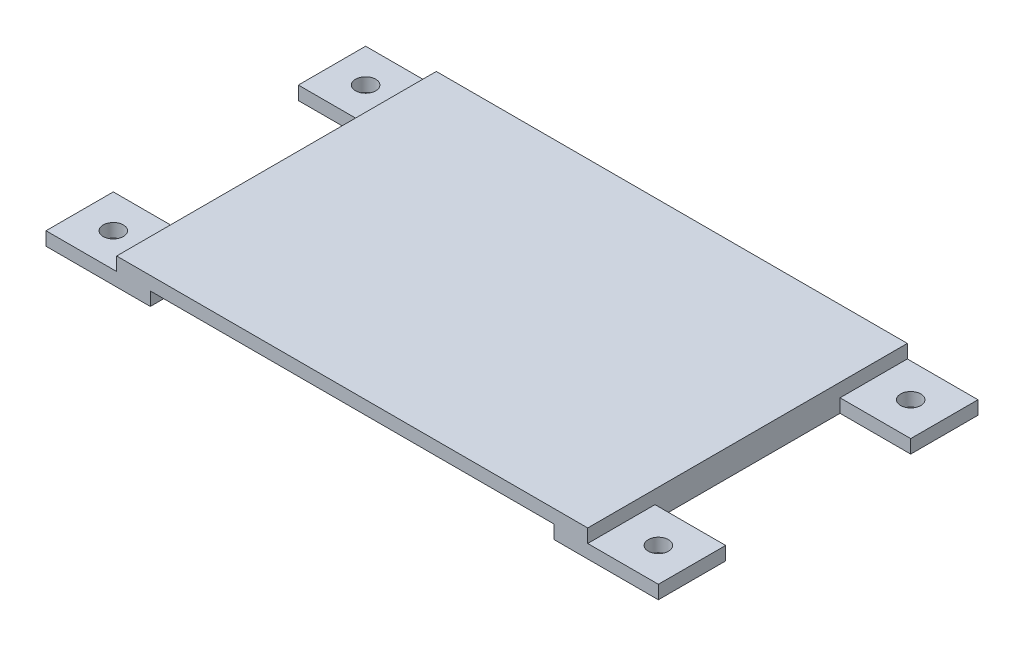
ISO-10303-21;
HEADER;
FILE_DESCRIPTION(('STEP AP214'),'2;1');
FILE_NAME('part.step','',(''),(''),'','','');
FILE_SCHEMA(('AUTOMOTIVE_DESIGN { 1 0 10303 214 1 1 1 1 }'));
ENDSEC;
DATA;
#1=APPLICATION_CONTEXT('core data for automotive mechanical design processes');
#2=APPLICATION_PROTOCOL_DEFINITION('international standard','automotive_design',2000,#1);
#3=PRODUCT_CONTEXT('',#1,'mechanical');
#4=PRODUCT('Part','Part','',(#3));
#5=PRODUCT_RELATED_PRODUCT_CATEGORY('part','',(#4));
#6=PRODUCT_DEFINITION_FORMATION('','',#4);
#7=PRODUCT_DEFINITION_CONTEXT('part definition',#1,'design');
#8=PRODUCT_DEFINITION('design','',#6,#7);
#9=PRODUCT_DEFINITION_SHAPE('','',#8);
#10=(LENGTH_UNIT() NAMED_UNIT(*) SI_UNIT(.MILLI.,.METRE.));
#11=(NAMED_UNIT(*) PLANE_ANGLE_UNIT() SI_UNIT($,.RADIAN.));
#12=(NAMED_UNIT(*) SI_UNIT($,.STERADIAN.) SOLID_ANGLE_UNIT());
#13=UNCERTAINTY_MEASURE_WITH_UNIT(LENGTH_MEASURE(1.E-05),#10,'distance_accuracy_value','');
#14=(GEOMETRIC_REPRESENTATION_CONTEXT(3) GLOBAL_UNCERTAINTY_ASSIGNED_CONTEXT((#13)) GLOBAL_UNIT_ASSIGNED_CONTEXT((#10,
#11,#12)) REPRESENTATION_CONTEXT('',''));
#15=CARTESIAN_POINT('',(0.,0.,0.));
#16=DIRECTION('',(0.,0.,1.));
#17=DIRECTION('',(1.,0.,0.));
#18=AXIS2_PLACEMENT_3D('',#15,#16,#17);
#19=CARTESIAN_POINT('',(0.,0.,0.));
#20=DIRECTION('',(0.,-1.,0.));
#21=DIRECTION('',(0.,0.,-1.));
#22=AXIS2_PLACEMENT_3D('',#19,#20,#21);
#23=PLANE('',#22);
#24=DIRECTION('',(0.,0.,-1.));
#25=VECTOR('',#24,1.);
#26=CARTESIAN_POINT('',(31.,0.,95.));
#27=LINE('',#26,#25);
#28=CARTESIAN_POINT('',(31.,0.,95.));
#29=VERTEX_POINT('',#28);
#30=CARTESIAN_POINT('',(31.,0.,0.));
#31=VERTEX_POINT('',#30);
#32=EDGE_CURVE('E397',#29,#31,#27,.T.);
#33=ORIENTED_EDGE('',*,*,#32,.F.);
#34=DIRECTION('',(1.,0.,0.));
#35=VECTOR('',#34,1.);
#36=CARTESIAN_POINT('',(182.,0.,95.));
#37=LINE('',#36,#35);
#38=CARTESIAN_POINT('',(0.,0.,95.));
#39=VERTEX_POINT('',#38);
#40=EDGE_CURVE('E290',#39,#29,#37,.T.);
#41=ORIENTED_EDGE('',*,*,#40,.F.);
#42=DIRECTION('',(0.,0.,1.));
#43=VECTOR('',#42,1.);
#44=CARTESIAN_POINT('',(0.,0.,95.));
#45=LINE('',#44,#43);
#46=CARTESIAN_POINT('',(0.,0.,75.));
#47=VERTEX_POINT('',#46);
#48=EDGE_CURVE('E286',#47,#39,#45,.T.);
#49=ORIENTED_EDGE('',*,*,#48,.F.);
#50=DIRECTION('',(-1.,0.,0.));
#51=VECTOR('',#50,1.);
#52=CARTESIAN_POINT('',(0.,0.,75.));
#53=LINE('',#52,#51);
#54=CARTESIAN_POINT('',(21.,0.,75.));
#55=VERTEX_POINT('',#54);
#56=EDGE_CURVE('E283',#55,#47,#53,.T.);
#57=ORIENTED_EDGE('',*,*,#56,.F.);
#58=DIRECTION('',(0.,0.,1.));
#59=VECTOR('',#58,1.);
#60=CARTESIAN_POINT('',(21.,0.,75.));
#61=LINE('',#60,#59);
#62=CARTESIAN_POINT('',(21.,0.,20.));
#63=VERTEX_POINT('',#62);
#64=EDGE_CURVE('E280',#63,#55,#61,.T.);
#65=ORIENTED_EDGE('',*,*,#64,.F.);
#66=DIRECTION('',(1.,0.,0.));
#67=VECTOR('',#66,1.);
#68=CARTESIAN_POINT('',(21.,0.,20.));
#69=LINE('',#68,#67);
#70=CARTESIAN_POINT('',(0.,0.,20.));
#71=VERTEX_POINT('',#70);
#72=EDGE_CURVE('E277',#71,#63,#69,.T.);
#73=ORIENTED_EDGE('',*,*,#72,.F.);
#74=DIRECTION('',(0.,0.,1.));
#75=VECTOR('',#74,1.);
#76=CARTESIAN_POINT('',(0.,0.,20.));
#77=LINE('',#76,#75);
#78=CARTESIAN_POINT('',(0.,0.,0.));
#79=VERTEX_POINT('',#78);
#80=EDGE_CURVE('E263',#79,#71,#77,.T.);
#81=ORIENTED_EDGE('',*,*,#80,.F.);
#82=DIRECTION('',(-1.,0.,0.));
#83=VECTOR('',#82,1.);
#84=CARTESIAN_POINT('',(0.,0.,0.));
#85=LINE('',#84,#83);
#86=EDGE_CURVE('E308',#31,#79,#85,.T.);
#87=ORIENTED_EDGE('',*,*,#86,.F.);
#88=EDGE_LOOP('',(#33,#41,#49,#57,#65,#73,#81,#87));
#89=FACE_BOUND('',#88,.T.);
#90=CARTESIAN_POINT('',(10.,0.,10.));
#91=DIRECTION('',(0.,1.,0.));
#92=DIRECTION('',(0.,0.,1.));
#93=AXIS2_PLACEMENT_3D('',#90,#91,#92);
#94=CIRCLE('',#93,3.);
#95=CARTESIAN_POINT('',(10.,0.,13.));
#96=VERTEX_POINT('',#95);
#97=EDGE_CURVE('E257',#96,#96,#94,.T.);
#98=ORIENTED_EDGE('',*,*,#97,.T.);
#99=EDGE_LOOP('',(#98));
#100=FACE_BOUND('',#99,.T.);
#101=CARTESIAN_POINT('',(10.,0.,85.));
#102=DIRECTION('',(0.,1.,0.));
#103=DIRECTION('',(0.,0.,1.));
#104=AXIS2_PLACEMENT_3D('',#101,#102,#103);
#105=CIRCLE('',#104,3.);
#106=CARTESIAN_POINT('',(10.,0.,88.));
#107=VERTEX_POINT('',#106);
#108=EDGE_CURVE('E254',#107,#107,#105,.T.);
#109=ORIENTED_EDGE('',*,*,#108,.T.);
#110=EDGE_LOOP('',(#109));
#111=FACE_BOUND('',#110,.T.);
#112=ADVANCED_FACE('F38',(#89,#100,#111),#23,.T.);
#113=CARTESIAN_POINT('',(182.,8.,95.));
#114=DIRECTION('',(-1.,0.,0.));
#115=DIRECTION('',(0.,0.,1.));
#116=AXIS2_PLACEMENT_3D('',#113,#114,#115);
#117=PLANE('',#116);
#118=DIRECTION('',(0.,0.,-1.));
#119=VECTOR('',#118,1.);
#120=CARTESIAN_POINT('',(182.,4.,95.));
#121=LINE('',#120,#119);
#122=CARTESIAN_POINT('',(182.,4.,95.));
#123=VERTEX_POINT('',#122);
#124=CARTESIAN_POINT('',(182.,4.,75.));
#125=VERTEX_POINT('',#124);
#126=EDGE_CURVE('E216',#123,#125,#121,.T.);
#127=ORIENTED_EDGE('',*,*,#126,.F.);
#128=DIRECTION('',(0.,-1.,0.));
#129=VECTOR('',#128,1.);
#130=CARTESIAN_POINT('',(182.,8.,95.));
#131=LINE('',#130,#129);
#132=CARTESIAN_POINT('',(182.,0.,95.));
#133=VERTEX_POINT('',#132);
#134=EDGE_CURVE('E322',#123,#133,#131,.T.);
#135=ORIENTED_EDGE('',*,*,#134,.T.);
#136=DIRECTION('',(0.,0.,-1.));
#137=VECTOR('',#136,1.);
#138=CARTESIAN_POINT('',(182.,0.,95.));
#139=LINE('',#138,#137);
#140=CARTESIAN_POINT('',(182.,0.,75.));
#141=VERTEX_POINT('',#140);
#142=EDGE_CURVE('E293',#133,#141,#139,.T.);
#143=ORIENTED_EDGE('',*,*,#142,.T.);
#144=DIRECTION('',(0.,-1.,0.));
#145=VECTOR('',#144,1.);
#146=CARTESIAN_POINT('',(182.,8.,75.));
#147=LINE('',#146,#145);
#148=EDGE_CURVE('E320',#125,#141,#147,.T.);
#149=ORIENTED_EDGE('',*,*,#148,.F.);
#150=EDGE_LOOP('',(#127,#135,#143,#149));
#151=FACE_BOUND('',#150,.T.);
#152=ADVANCED_FACE('F383',(#151),#117,.F.);
#153=CARTESIAN_POINT('',(182.,8.,75.));
#154=DIRECTION('',(0.,0.,1.));
#155=DIRECTION('',(1.,0.,0.));
#156=AXIS2_PLACEMENT_3D('',#153,#154,#155);
#157=PLANE('',#156);
#158=DIRECTION('',(-1.,0.,0.));
#159=VECTOR('',#158,1.);
#160=CARTESIAN_POINT('',(182.,4.,75.));
#161=LINE('',#160,#159);
#162=CARTESIAN_POINT('',(161.,4.,75.));
#163=VERTEX_POINT('',#162);
#164=EDGE_CURVE('E231',#125,#163,#161,.T.);
#165=ORIENTED_EDGE('',*,*,#164,.F.);
#166=ORIENTED_EDGE('',*,*,#148,.T.);
#167=DIRECTION('',(-1.,0.,0.));
#168=VECTOR('',#167,1.);
#169=CARTESIAN_POINT('',(182.,0.,75.));
#170=LINE('',#169,#168);
#171=CARTESIAN_POINT('',(161.,0.,75.));
#172=VERTEX_POINT('',#171);
#173=EDGE_CURVE('E296',#141,#172,#170,.T.);
#174=ORIENTED_EDGE('',*,*,#173,.T.);
#175=DIRECTION('',(0.,-1.,0.));
#176=VECTOR('',#175,1.);
#177=CARTESIAN_POINT('',(161.,8.,75.));
#178=LINE('',#177,#176);
#179=EDGE_CURVE('E318',#163,#172,#178,.T.);
#180=ORIENTED_EDGE('',*,*,#179,.F.);
#181=EDGE_LOOP('',(#165,#166,#174,#180));
#182=FACE_BOUND('',#181,.T.);
#183=ADVANCED_FACE('F364',(#182),#157,.F.);
#184=CARTESIAN_POINT('',(172.,8.,85.));
#185=DIRECTION('',(0.,-1.,0.));
#186=DIRECTION('',(0.,0.,-1.));
#187=AXIS2_PLACEMENT_3D('',#184,#185,#186);
#188=CYLINDRICAL_SURFACE('',#187,3.00000000000002);
#189=CARTESIAN_POINT('',(172.,0.,85.));
#190=DIRECTION('',(0.,1.,0.));
#191=DIRECTION('',(0.,0.,-1.));
#192=AXIS2_PLACEMENT_3D('',#189,#190,#191);
#193=CIRCLE('',#192,3.00000000000002);
#194=CARTESIAN_POINT('',(172.,0.,82.));
#195=VERTEX_POINT('',#194);
#196=EDGE_CURVE('E251',#195,#195,#193,.T.);
#197=ORIENTED_EDGE('',*,*,#196,.F.);
#198=EDGE_LOOP('',(#197));
#199=FACE_BOUND('',#198,.T.);
#200=CARTESIAN_POINT('',(172.,4.,85.));
#201=DIRECTION('',(0.,1.,0.));
#202=DIRECTION('',(0.,0.,1.));
#203=AXIS2_PLACEMENT_3D('',#200,#201,#202);
#204=CIRCLE('',#203,3.00000000000002);
#205=CARTESIAN_POINT('',(172.,4.,88.));
#206=VERTEX_POINT('',#205);
#207=EDGE_CURVE('E250',#206,#206,#204,.T.);
#208=ORIENTED_EDGE('',*,*,#207,.T.);
#209=EDGE_LOOP('',(#208));
#210=FACE_BOUND('',#209,.T.);
#211=ADVANCED_FACE('F361',(#199,#210),#188,.F.);
#212=CARTESIAN_POINT('',(0.,8.,0.));
#213=DIRECTION('',(0.,-1.,0.));
#214=DIRECTION('',(0.,0.,-1.));
#215=AXIS2_PLACEMENT_3D('',#212,#213,#214);
#216=PLANE('',#215);
#217=DIRECTION('',(-1.,0.,0.));
#218=VECTOR('',#217,1.);
#219=CARTESIAN_POINT('',(182.,8.,0.));
#220=LINE('',#219,#218);
#221=CARTESIAN_POINT('',(161.,8.,0.));
#222=VERTEX_POINT('',#221);
#223=CARTESIAN_POINT('',(21.,8.,0.));
#224=VERTEX_POINT('',#223);
#225=EDGE_CURVE('E271',#222,#224,#220,.T.);
#226=ORIENTED_EDGE('',*,*,#225,.T.);
#227=DIRECTION('',(0.,0.,1.));
#228=VECTOR('',#227,1.);
#229=CARTESIAN_POINT('',(21.,8.,75.));
#230=LINE('',#229,#228);
#231=CARTESIAN_POINT('',(21.,8.,95.));
#232=VERTEX_POINT('',#231);
#233=EDGE_CURVE('E264',#224,#232,#230,.T.);
#234=ORIENTED_EDGE('',*,*,#233,.T.);
#235=DIRECTION('',(1.,0.,0.));
#236=VECTOR('',#235,1.);
#237=CARTESIAN_POINT('',(182.,8.,95.));
#238=LINE('',#237,#236);
#239=CARTESIAN_POINT('',(161.,8.,95.));
#240=VERTEX_POINT('',#239);
#241=EDGE_CURVE('E266',#232,#240,#238,.T.);
#242=ORIENTED_EDGE('',*,*,#241,.T.);
#243=DIRECTION('',(0.,0.,-1.));
#244=VECTOR('',#243,1.);
#245=CARTESIAN_POINT('',(161.,8.,75.));
#246=LINE('',#245,#244);
#247=EDGE_CURVE('E269',#240,#222,#246,.T.);
#248=ORIENTED_EDGE('',*,*,#247,.T.);
#249=EDGE_LOOP('',(#226,#234,#242,#248));
#250=FACE_BOUND('',#249,.T.);
#251=ADVANCED_FACE('F356',(#250),#216,.F.);
#252=DIRECTION('',(0.,0.,1.));
#253=VECTOR('',#252,1.);
#254=CARTESIAN_POINT('',(151.,0.,95.));
#255=LINE('',#254,#253);
#256=CARTESIAN_POINT('',(151.,0.,0.));
#257=VERTEX_POINT('',#256);
#258=CARTESIAN_POINT('',(151.,0.,95.));
#259=VERTEX_POINT('',#258);
#260=EDGE_CURVE('E396',#257,#259,#255,.T.);
#261=ORIENTED_EDGE('',*,*,#260,.F.);
#262=CARTESIAN_POINT('',(182.,0.,0.));
#263=VERTEX_POINT('',#262);
#264=EDGE_CURVE('E196',#263,#257,#85,.T.);
#265=ORIENTED_EDGE('',*,*,#264,.F.);
#266=DIRECTION('',(0.,0.,-1.));
#267=VECTOR('',#266,1.);
#268=CARTESIAN_POINT('',(182.,0.,20.));
#269=LINE('',#268,#267);
#270=CARTESIAN_POINT('',(182.,0.,20.));
#271=VERTEX_POINT('',#270);
#272=EDGE_CURVE('E305',#271,#263,#269,.T.);
#273=ORIENTED_EDGE('',*,*,#272,.F.);
#274=DIRECTION('',(1.,0.,0.));
#275=VECTOR('',#274,1.);
#276=CARTESIAN_POINT('',(161.,0.,20.));
#277=LINE('',#276,#275);
#278=CARTESIAN_POINT('',(161.,0.,20.));
#279=VERTEX_POINT('',#278);
#280=EDGE_CURVE('E302',#279,#271,#277,.T.);
#281=ORIENTED_EDGE('',*,*,#280,.F.);
#282=DIRECTION('',(0.,0.,-1.));
#283=VECTOR('',#282,1.);
#284=CARTESIAN_POINT('',(161.,0.,75.));
#285=LINE('',#284,#283);
#286=EDGE_CURVE('E299',#172,#279,#285,.T.);
#287=ORIENTED_EDGE('',*,*,#286,.F.);
#288=ORIENTED_EDGE('',*,*,#173,.F.);
#289=ORIENTED_EDGE('',*,*,#142,.F.);
#290=EDGE_CURVE('E289',#259,#133,#37,.T.);
#291=ORIENTED_EDGE('',*,*,#290,.F.);
#292=EDGE_LOOP('',(#261,#265,#273,#281,#287,#288,#289,#291));
#293=FACE_BOUND('',#292,.T.);
#294=CARTESIAN_POINT('',(172.,0.,10.));
#295=DIRECTION('',(0.,1.,0.));
#296=DIRECTION('',(0.,0.,-1.));
#297=AXIS2_PLACEMENT_3D('',#294,#295,#296);
#298=CIRCLE('',#297,3.00000000000002);
#299=CARTESIAN_POINT('',(172.,0.,7.00000000000002));
#300=VERTEX_POINT('',#299);
#301=EDGE_CURVE('E260',#300,#300,#298,.T.);
#302=ORIENTED_EDGE('',*,*,#301,.T.);
#303=EDGE_LOOP('',(#302));
#304=FACE_BOUND('',#303,.T.);
#305=ORIENTED_EDGE('',*,*,#196,.T.);
#306=EDGE_LOOP('',(#305));
#307=FACE_BOUND('',#306,.T.);
#308=ADVANCED_FACE('F353',(#293,#304,#307),#23,.T.);
#309=CARTESIAN_POINT('',(0.,8.,20.));
#310=DIRECTION('',(1.,0.,0.));
#311=DIRECTION('',(0.,0.,-1.));
#312=AXIS2_PLACEMENT_3D('',#309,#310,#311);
#313=PLANE('',#312);
#314=DIRECTION('',(0.,-1.,0.));
#315=VECTOR('',#314,1.);
#316=CARTESIAN_POINT('',(0.,8.,20.));
#317=LINE('',#316,#315);
#318=CARTESIAN_POINT('',(0.,4.,20.));
#319=VERTEX_POINT('',#318);
#320=EDGE_CURVE('E11',#319,#71,#317,.T.);
#321=ORIENTED_EDGE('',*,*,#320,.F.);
#322=DIRECTION('',(0.,0.,1.));
#323=VECTOR('',#322,1.);
#324=CARTESIAN_POINT('',(0.,4.,20.));
#325=LINE('',#324,#323);
#326=CARTESIAN_POINT('',(0.,4.,0.));
#327=VERTEX_POINT('',#326);
#328=EDGE_CURVE('E217',#327,#319,#325,.T.);
#329=ORIENTED_EDGE('',*,*,#328,.F.);
#330=DIRECTION('',(0.,-1.,0.));
#331=VECTOR('',#330,1.);
#332=CARTESIAN_POINT('',(0.,8.,0.));
#333=LINE('',#332,#331);
#334=EDGE_CURVE('E274',#327,#79,#333,.T.);
#335=ORIENTED_EDGE('',*,*,#334,.T.);
#336=ORIENTED_EDGE('',*,*,#80,.T.);
#337=EDGE_LOOP('',(#321,#329,#335,#336));
#338=FACE_BOUND('',#337,.T.);
#339=ADVANCED_FACE('F40',(#338),#313,.F.);
#340=CARTESIAN_POINT('',(21.,8.,20.));
#341=DIRECTION('',(0.,0.,-1.));
#342=DIRECTION('',(-1.,0.,0.));
#343=AXIS2_PLACEMENT_3D('',#340,#341,#342);
#344=PLANE('',#343);
#345=DIRECTION('',(0.,-1.,0.));
#346=VECTOR('',#345,1.);
#347=CARTESIAN_POINT('',(21.,8.,20.));
#348=LINE('',#347,#346);
#349=CARTESIAN_POINT('',(21.,4.,20.));
#350=VERTEX_POINT('',#349);
#351=EDGE_CURVE('E47',#350,#63,#348,.T.);
#352=ORIENTED_EDGE('',*,*,#351,.F.);
#353=DIRECTION('',(1.,0.,0.));
#354=VECTOR('',#353,1.);
#355=CARTESIAN_POINT('',(0.,4.,20.));
#356=LINE('',#355,#354);
#357=EDGE_CURVE('E219',#319,#350,#356,.T.);
#358=ORIENTED_EDGE('',*,*,#357,.F.);
#359=ORIENTED_EDGE('',*,*,#320,.T.);
#360=ORIENTED_EDGE('',*,*,#72,.T.);
#361=EDGE_LOOP('',(#352,#358,#359,#360));
#362=FACE_BOUND('',#361,.T.);
#363=ADVANCED_FACE('F430',(#362),#344,.F.);
#364=CARTESIAN_POINT('',(21.,8.,75.));
#365=DIRECTION('',(1.,0.,0.));
#366=DIRECTION('',(0.,0.,-1.));
#367=AXIS2_PLACEMENT_3D('',#364,#365,#366);
#368=PLANE('',#367);
#369=ORIENTED_EDGE('',*,*,#64,.T.);
#370=DIRECTION('',(0.,-1.,0.));
#371=VECTOR('',#370,1.);
#372=CARTESIAN_POINT('',(21.,8.,75.));
#373=LINE('',#372,#371);
#374=CARTESIAN_POINT('',(21.,4.,75.));
#375=VERTEX_POINT('',#374);
#376=EDGE_CURVE('E329',#375,#55,#373,.T.);
#377=ORIENTED_EDGE('',*,*,#376,.F.);
#378=DIRECTION('',(0.,0.,-1.));
#379=VECTOR('',#378,1.);
#380=CARTESIAN_POINT('',(21.,4.,95.));
#381=LINE('',#380,#379);
#382=CARTESIAN_POINT('',(21.,4.,95.));
#383=VERTEX_POINT('',#382);
#384=EDGE_CURVE('E243',#383,#375,#381,.T.);
#385=ORIENTED_EDGE('',*,*,#384,.F.);
#386=DIRECTION('',(0.,1.,0.));
#387=VECTOR('',#386,1.);
#388=CARTESIAN_POINT('',(21.,4.,95.));
#389=LINE('',#388,#387);
#390=EDGE_CURVE('E247',#383,#232,#389,.T.);
#391=ORIENTED_EDGE('',*,*,#390,.T.);
#392=ORIENTED_EDGE('',*,*,#233,.F.);
#393=DIRECTION('',(0.,1.,0.));
#394=VECTOR('',#393,1.);
#395=CARTESIAN_POINT('',(21.,4.,0.));
#396=LINE('',#395,#394);
#397=CARTESIAN_POINT('',(21.,4.,0.));
#398=VERTEX_POINT('',#397);
#399=EDGE_CURVE('E227',#398,#224,#396,.T.);
#400=ORIENTED_EDGE('',*,*,#399,.F.);
#401=DIRECTION('',(0.,0.,-1.));
#402=VECTOR('',#401,1.);
#403=CARTESIAN_POINT('',(21.,4.,20.));
#404=LINE('',#403,#402);
#405=EDGE_CURVE('E223',#350,#398,#404,.T.);
#406=ORIENTED_EDGE('',*,*,#405,.F.);
#407=ORIENTED_EDGE('',*,*,#351,.T.);
#408=EDGE_LOOP('',(#369,#377,#385,#391,#392,#400,#406,#407));
#409=FACE_BOUND('',#408,.T.);
#410=ADVANCED_FACE('F425',(#409),#368,.F.);
#411=CARTESIAN_POINT('',(0.,8.,75.));
#412=DIRECTION('',(0.,0.,1.));
#413=DIRECTION('',(1.,0.,0.));
#414=AXIS2_PLACEMENT_3D('',#411,#412,#413);
#415=PLANE('',#414);
#416=DIRECTION('',(0.,-1.,0.));
#417=VECTOR('',#416,1.);
#418=CARTESIAN_POINT('',(0.,8.,75.));
#419=LINE('',#418,#417);
#420=CARTESIAN_POINT('',(0.,4.,75.));
#421=VERTEX_POINT('',#420);
#422=EDGE_CURVE('E327',#421,#47,#419,.T.);
#423=ORIENTED_EDGE('',*,*,#422,.F.);
#424=DIRECTION('',(-1.,0.,0.));
#425=VECTOR('',#424,1.);
#426=CARTESIAN_POINT('',(0.,4.,75.));
#427=LINE('',#426,#425);
#428=EDGE_CURVE('E245',#375,#421,#427,.T.);
#429=ORIENTED_EDGE('',*,*,#428,.F.);
#430=ORIENTED_EDGE('',*,*,#376,.T.);
#431=ORIENTED_EDGE('',*,*,#56,.T.);
#432=EDGE_LOOP('',(#423,#429,#430,#431));
#433=FACE_BOUND('',#432,.T.);
#434=ADVANCED_FACE('F421',(#433),#415,.F.);
#435=CARTESIAN_POINT('',(0.,8.,95.));
#436=DIRECTION('',(1.,0.,0.));
#437=DIRECTION('',(0.,0.,-1.));
#438=AXIS2_PLACEMENT_3D('',#435,#436,#437);
#439=PLANE('',#438);
#440=DIRECTION('',(0.,-1.,0.));
#441=VECTOR('',#440,1.);
#442=CARTESIAN_POINT('',(0.,8.,95.));
#443=LINE('',#442,#441);
#444=CARTESIAN_POINT('',(0.,4.,95.));
#445=VERTEX_POINT('',#444);
#446=EDGE_CURVE('E325',#445,#39,#443,.T.);
#447=ORIENTED_EDGE('',*,*,#446,.F.);
#448=DIRECTION('',(0.,0.,1.));
#449=VECTOR('',#448,1.);
#450=CARTESIAN_POINT('',(0.,4.,95.));
#451=LINE('',#450,#449);
#452=EDGE_CURVE('E63',#421,#445,#451,.T.);
#453=ORIENTED_EDGE('',*,*,#452,.F.);
#454=ORIENTED_EDGE('',*,*,#422,.T.);
#455=ORIENTED_EDGE('',*,*,#48,.T.);
#456=EDGE_LOOP('',(#447,#453,#454,#455));
#457=FACE_BOUND('',#456,.T.);
#458=ADVANCED_FACE('F415',(#457),#439,.F.);
#459=CARTESIAN_POINT('',(182.,8.,95.));
#460=DIRECTION('',(0.,0.,-1.));
#461=DIRECTION('',(-1.,0.,0.));
#462=AXIS2_PLACEMENT_3D('',#459,#460,#461);
#463=PLANE('',#462);
#464=ORIENTED_EDGE('',*,*,#40,.T.);
#465=DIRECTION('',(0.,-1.,0.));
#466=VECTOR('',#465,1.);
#467=CARTESIAN_POINT('',(31.,4.,95.));
#468=LINE('',#467,#466);
#469=CARTESIAN_POINT('',(31.,4.,95.));
#470=VERTEX_POINT('',#469);
#471=EDGE_CURVE('E199',#470,#29,#468,.T.);
#472=ORIENTED_EDGE('',*,*,#471,.F.);
#473=DIRECTION('',(-1.,0.,0.));
#474=VECTOR('',#473,1.);
#475=CARTESIAN_POINT('',(31.,4.,95.));
#476=LINE('',#475,#474);
#477=CARTESIAN_POINT('',(151.,4.,95.));
#478=VERTEX_POINT('',#477);
#479=EDGE_CURVE('E185',#478,#470,#476,.T.);
#480=ORIENTED_EDGE('',*,*,#479,.F.);
#481=DIRECTION('',(0.,-1.,0.));
#482=VECTOR('',#481,1.);
#483=CARTESIAN_POINT('',(151.,4.,95.));
#484=LINE('',#483,#482);
#485=EDGE_CURVE('E183',#478,#259,#484,.T.);
#486=ORIENTED_EDGE('',*,*,#485,.T.);
#487=ORIENTED_EDGE('',*,*,#290,.T.);
#488=ORIENTED_EDGE('',*,*,#134,.F.);
#489=DIRECTION('',(1.,0.,0.));
#490=VECTOR('',#489,1.);
#491=CARTESIAN_POINT('',(182.,4.,95.));
#492=LINE('',#491,#490);
#493=CARTESIAN_POINT('',(161.,4.,95.));
#494=VERTEX_POINT('',#493);
#495=EDGE_CURVE('E236',#494,#123,#492,.T.);
#496=ORIENTED_EDGE('',*,*,#495,.F.);
#497=DIRECTION('',(0.,1.,0.));
#498=VECTOR('',#497,1.);
#499=CARTESIAN_POINT('',(161.,4.,95.));
#500=LINE('',#499,#498);
#501=EDGE_CURVE('E220',#494,#240,#500,.T.);
#502=ORIENTED_EDGE('',*,*,#501,.T.);
#503=ORIENTED_EDGE('',*,*,#241,.F.);
#504=ORIENTED_EDGE('',*,*,#390,.F.);
#505=DIRECTION('',(1.,0.,0.));
#506=VECTOR('',#505,1.);
#507=CARTESIAN_POINT('',(0.,4.,95.));
#508=LINE('',#507,#506);
#509=EDGE_CURVE('E241',#445,#383,#508,.T.);
#510=ORIENTED_EDGE('',*,*,#509,.F.);
#511=ORIENTED_EDGE('',*,*,#446,.T.);
#512=EDGE_LOOP('',(#464,#472,#480,#486,#487,#488,#496,#502,#503,#504,#510,#511));
#513=FACE_BOUND('',#512,.T.);
#514=ADVANCED_FACE('F394',(#513),#463,.F.);
#515=CARTESIAN_POINT('',(161.,8.,75.));
#516=DIRECTION('',(-1.,0.,0.));
#517=DIRECTION('',(0.,0.,1.));
#518=AXIS2_PLACEMENT_3D('',#515,#516,#517);
#519=PLANE('',#518);
#520=ORIENTED_EDGE('',*,*,#286,.T.);
#521=DIRECTION('',(0.,-1.,0.));
#522=VECTOR('',#521,1.);
#523=CARTESIAN_POINT('',(161.,8.,20.));
#524=LINE('',#523,#522);
#525=CARTESIAN_POINT('',(161.,4.,20.));
#526=VERTEX_POINT('',#525);
#527=EDGE_CURVE('E316',#526,#279,#524,.T.);
#528=ORIENTED_EDGE('',*,*,#527,.F.);
#529=DIRECTION('',(0.,0.,1.));
#530=VECTOR('',#529,1.);
#531=CARTESIAN_POINT('',(161.,4.,0.));
#532=LINE('',#531,#530);
#533=CARTESIAN_POINT('',(161.,4.,0.));
#534=VERTEX_POINT('',#533);
#535=EDGE_CURVE('E209',#534,#526,#532,.T.);
#536=ORIENTED_EDGE('',*,*,#535,.F.);
#537=DIRECTION('',(0.,1.,0.));
#538=VECTOR('',#537,1.);
#539=CARTESIAN_POINT('',(161.,4.,0.));
#540=LINE('',#539,#538);
#541=EDGE_CURVE('E213',#534,#222,#540,.T.);
#542=ORIENTED_EDGE('',*,*,#541,.T.);
#543=ORIENTED_EDGE('',*,*,#247,.F.);
#544=ORIENTED_EDGE('',*,*,#501,.F.);
#545=DIRECTION('',(0.,0.,1.));
#546=VECTOR('',#545,1.);
#547=CARTESIAN_POINT('',(161.,4.,95.));
#548=LINE('',#547,#546);
#549=EDGE_CURVE('E233',#163,#494,#548,.T.);
#550=ORIENTED_EDGE('',*,*,#549,.F.);
#551=ORIENTED_EDGE('',*,*,#179,.T.);
#552=EDGE_LOOP('',(#520,#528,#536,#542,#543,#544,#550,#551));
#553=FACE_BOUND('',#552,.T.);
#554=ADVANCED_FACE('F392',(#553),#519,.F.);
#555=CARTESIAN_POINT('',(161.,8.,20.));
#556=DIRECTION('',(0.,0.,-1.));
#557=DIRECTION('',(-1.,0.,0.));
#558=AXIS2_PLACEMENT_3D('',#555,#556,#557);
#559=PLANE('',#558);
#560=DIRECTION('',(0.,-1.,0.));
#561=VECTOR('',#560,1.);
#562=CARTESIAN_POINT('',(182.,8.,20.));
#563=LINE('',#562,#561);
#564=CARTESIAN_POINT('',(182.,4.,20.));
#565=VERTEX_POINT('',#564);
#566=EDGE_CURVE('E314',#565,#271,#563,.T.);
#567=ORIENTED_EDGE('',*,*,#566,.F.);
#568=DIRECTION('',(1.,0.,0.));
#569=VECTOR('',#568,1.);
#570=CARTESIAN_POINT('',(182.,4.,20.));
#571=LINE('',#570,#569);
#572=EDGE_CURVE('E211',#526,#565,#571,.T.);
#573=ORIENTED_EDGE('',*,*,#572,.F.);
#574=ORIENTED_EDGE('',*,*,#527,.T.);
#575=ORIENTED_EDGE('',*,*,#280,.T.);
#576=EDGE_LOOP('',(#567,#573,#574,#575));
#577=FACE_BOUND('',#576,.T.);
#578=ADVANCED_FACE('F449',(#577),#559,.F.);
#579=CARTESIAN_POINT('',(182.,8.,20.));
#580=DIRECTION('',(-1.,0.,0.));
#581=DIRECTION('',(0.,0.,1.));
#582=AXIS2_PLACEMENT_3D('',#579,#580,#581);
#583=PLANE('',#582);
#584=DIRECTION('',(0.,-1.,0.));
#585=VECTOR('',#584,1.);
#586=CARTESIAN_POINT('',(182.,8.,0.));
#587=LINE('',#586,#585);
#588=CARTESIAN_POINT('',(182.,4.,0.));
#589=VERTEX_POINT('',#588);
#590=EDGE_CURVE('E312',#589,#263,#587,.T.);
#591=ORIENTED_EDGE('',*,*,#590,.F.);
#592=DIRECTION('',(0.,0.,-1.));
#593=VECTOR('',#592,1.);
#594=CARTESIAN_POINT('',(182.,4.,0.));
#595=LINE('',#594,#593);
#596=EDGE_CURVE('E204',#565,#589,#595,.T.);
#597=ORIENTED_EDGE('',*,*,#596,.F.);
#598=ORIENTED_EDGE('',*,*,#566,.T.);
#599=ORIENTED_EDGE('',*,*,#272,.T.);
#600=EDGE_LOOP('',(#591,#597,#598,#599));
#601=FACE_BOUND('',#600,.T.);
#602=ADVANCED_FACE('F447',(#601),#583,.F.);
#603=CARTESIAN_POINT('',(0.,8.,0.));
#604=DIRECTION('',(0.,0.,1.));
#605=DIRECTION('',(1.,0.,0.));
#606=AXIS2_PLACEMENT_3D('',#603,#604,#605);
#607=PLANE('',#606);
#608=DIRECTION('',(1.,0.,0.));
#609=VECTOR('',#608,1.);
#610=CARTESIAN_POINT('',(31.,4.,0.));
#611=LINE('',#610,#609);
#612=CARTESIAN_POINT('',(31.,4.,0.));
#613=VERTEX_POINT('',#612);
#614=CARTESIAN_POINT('',(151.,4.,0.));
#615=VERTEX_POINT('',#614);
#616=EDGE_CURVE('E186',#613,#615,#611,.T.);
#617=ORIENTED_EDGE('',*,*,#616,.F.);
#618=DIRECTION('',(0.,-1.,0.));
#619=VECTOR('',#618,1.);
#620=CARTESIAN_POINT('',(31.,4.,0.));
#621=LINE('',#620,#619);
#622=EDGE_CURVE('E197',#613,#31,#621,.T.);
#623=ORIENTED_EDGE('',*,*,#622,.T.);
#624=ORIENTED_EDGE('',*,*,#86,.T.);
#625=ORIENTED_EDGE('',*,*,#334,.F.);
#626=DIRECTION('',(-1.,0.,0.));
#627=VECTOR('',#626,1.);
#628=CARTESIAN_POINT('',(0.,4.,0.));
#629=LINE('',#628,#627);
#630=EDGE_CURVE('E225',#398,#327,#629,.T.);
#631=ORIENTED_EDGE('',*,*,#630,.F.);
#632=ORIENTED_EDGE('',*,*,#399,.T.);
#633=ORIENTED_EDGE('',*,*,#225,.F.);
#634=ORIENTED_EDGE('',*,*,#541,.F.);
#635=DIRECTION('',(-1.,0.,0.));
#636=VECTOR('',#635,1.);
#637=CARTESIAN_POINT('',(182.,4.,0.));
#638=LINE('',#637,#636);
#639=EDGE_CURVE('E206',#589,#534,#638,.T.);
#640=ORIENTED_EDGE('',*,*,#639,.F.);
#641=ORIENTED_EDGE('',*,*,#590,.T.);
#642=ORIENTED_EDGE('',*,*,#264,.T.);
#643=DIRECTION('',(0.,-1.,0.));
#644=VECTOR('',#643,1.);
#645=CARTESIAN_POINT('',(151.,4.,0.));
#646=LINE('',#645,#644);
#647=EDGE_CURVE('E180',#615,#257,#646,.T.);
#648=ORIENTED_EDGE('',*,*,#647,.F.);
#649=EDGE_LOOP('',(#617,#623,#624,#625,#631,#632,#633,#634,#640,#641,#642,#648));
#650=FACE_BOUND('',#649,.T.);
#651=ADVANCED_FACE('F194',(#650),#607,.F.);
#652=CARTESIAN_POINT('',(172.,8.,10.));
#653=DIRECTION('',(0.,-1.,0.));
#654=DIRECTION('',(0.,0.,-1.));
#655=AXIS2_PLACEMENT_3D('',#652,#653,#654);
#656=CYLINDRICAL_SURFACE('',#655,3.00000000000002);
#657=CARTESIAN_POINT('',(172.,4.,10.));
#658=DIRECTION('',(0.,-1.,0.));
#659=DIRECTION('',(0.,0.,-1.));
#660=AXIS2_PLACEMENT_3D('',#657,#658,#659);
#661=CIRCLE('',#660,3.00000000000002);
#662=CARTESIAN_POINT('',(172.,4.,7.00000000000002));
#663=VERTEX_POINT('',#662);
#664=EDGE_CURVE('E42',#663,#663,#661,.T.);
#665=ORIENTED_EDGE('',*,*,#664,.F.);
#666=EDGE_LOOP('',(#665));
#667=FACE_BOUND('',#666,.T.);
#668=ORIENTED_EDGE('',*,*,#301,.F.);
#669=EDGE_LOOP('',(#668));
#670=FACE_BOUND('',#669,.T.);
#671=ADVANCED_FACE('F346',(#667,#670),#656,.F.);
#672=CARTESIAN_POINT('',(10.,8.,10.));
#673=DIRECTION('',(0.,-1.,0.));
#674=DIRECTION('',(0.,0.,-1.));
#675=AXIS2_PLACEMENT_3D('',#672,#673,#674);
#676=CYLINDRICAL_SURFACE('',#675,3.);
#677=CARTESIAN_POINT('',(10.,4.,10.));
#678=DIRECTION('',(0.,-1.,0.));
#679=DIRECTION('',(0.,0.,-1.));
#680=AXIS2_PLACEMENT_3D('',#677,#678,#679);
#681=CIRCLE('',#680,3.);
#682=CARTESIAN_POINT('',(10.,4.,7.));
#683=VERTEX_POINT('',#682);
#684=EDGE_CURVE('E336',#683,#683,#681,.T.);
#685=ORIENTED_EDGE('',*,*,#684,.F.);
#686=EDGE_LOOP('',(#685));
#687=FACE_BOUND('',#686,.T.);
#688=ORIENTED_EDGE('',*,*,#97,.F.);
#689=EDGE_LOOP('',(#688));
#690=FACE_BOUND('',#689,.T.);
#691=ADVANCED_FACE('F349',(#687,#690),#676,.F.);
#692=CARTESIAN_POINT('',(10.,8.,85.));
#693=DIRECTION('',(0.,-1.,0.));
#694=DIRECTION('',(0.,0.,-1.));
#695=AXIS2_PLACEMENT_3D('',#692,#693,#694);
#696=CYLINDRICAL_SURFACE('',#695,3.);
#697=CARTESIAN_POINT('',(10.,4.,85.));
#698=DIRECTION('',(0.,-1.,0.));
#699=DIRECTION('',(0.,0.,-1.));
#700=AXIS2_PLACEMENT_3D('',#697,#698,#699);
#701=CIRCLE('',#700,3.);
#702=CARTESIAN_POINT('',(10.,4.,82.));
#703=VERTEX_POINT('',#702);
#704=EDGE_CURVE('E334',#703,#703,#701,.T.);
#705=ORIENTED_EDGE('',*,*,#704,.F.);
#706=EDGE_LOOP('',(#705));
#707=FACE_BOUND('',#706,.T.);
#708=ORIENTED_EDGE('',*,*,#108,.F.);
#709=EDGE_LOOP('',(#708));
#710=FACE_BOUND('',#709,.T.);
#711=ADVANCED_FACE('F372',(#707,#710),#696,.F.);
#712=CARTESIAN_POINT('',(0.,4.,0.));
#713=DIRECTION('',(0.,1.,0.));
#714=DIRECTION('',(0.,0.,1.));
#715=AXIS2_PLACEMENT_3D('',#712,#713,#714);
#716=PLANE('',#715);
#717=ORIENTED_EDGE('',*,*,#207,.F.);
#718=EDGE_LOOP('',(#717));
#719=FACE_BOUND('',#718,.T.);
#720=ORIENTED_EDGE('',*,*,#126,.T.);
#721=ORIENTED_EDGE('',*,*,#164,.T.);
#722=ORIENTED_EDGE('',*,*,#549,.T.);
#723=ORIENTED_EDGE('',*,*,#495,.T.);
#724=EDGE_LOOP('',(#720,#721,#722,#723));
#725=FACE_BOUND('',#724,.T.);
#726=ADVANCED_FACE('F368',(#719,#725),#716,.T.);
#727=CARTESIAN_POINT('',(0.,4.,0.));
#728=DIRECTION('',(0.,-1.,0.));
#729=DIRECTION('',(0.,0.,-1.));
#730=AXIS2_PLACEMENT_3D('',#727,#728,#729);
#731=PLANE('',#730);
#732=ORIENTED_EDGE('',*,*,#704,.T.);
#733=EDGE_LOOP('',(#732));
#734=FACE_BOUND('',#733,.T.);
#735=ORIENTED_EDGE('',*,*,#452,.T.);
#736=ORIENTED_EDGE('',*,*,#509,.T.);
#737=ORIENTED_EDGE('',*,*,#384,.T.);
#738=ORIENTED_EDGE('',*,*,#428,.T.);
#739=EDGE_LOOP('',(#735,#736,#737,#738));
#740=FACE_BOUND('',#739,.T.);
#741=ADVANCED_FACE('F371',(#734,#740),#731,.F.);
#742=CARTESIAN_POINT('',(0.,4.,0.));
#743=DIRECTION('',(0.,-1.,0.));
#744=DIRECTION('',(0.,0.,-1.));
#745=AXIS2_PLACEMENT_3D('',#742,#743,#744);
#746=PLANE('',#745);
#747=ORIENTED_EDGE('',*,*,#684,.T.);
#748=EDGE_LOOP('',(#747));
#749=FACE_BOUND('',#748,.T.);
#750=ORIENTED_EDGE('',*,*,#328,.T.);
#751=ORIENTED_EDGE('',*,*,#357,.T.);
#752=ORIENTED_EDGE('',*,*,#405,.T.);
#753=ORIENTED_EDGE('',*,*,#630,.T.);
#754=EDGE_LOOP('',(#750,#751,#752,#753));
#755=FACE_BOUND('',#754,.T.);
#756=ADVANCED_FACE('F438',(#749,#755),#746,.F.);
#757=CARTESIAN_POINT('',(0.,4.,0.));
#758=DIRECTION('',(0.,-1.,0.));
#759=DIRECTION('',(0.,0.,-1.));
#760=AXIS2_PLACEMENT_3D('',#757,#758,#759);
#761=PLANE('',#760);
#762=ORIENTED_EDGE('',*,*,#664,.T.);
#763=EDGE_LOOP('',(#762));
#764=FACE_BOUND('',#763,.T.);
#765=ORIENTED_EDGE('',*,*,#596,.T.);
#766=ORIENTED_EDGE('',*,*,#639,.T.);
#767=ORIENTED_EDGE('',*,*,#535,.T.);
#768=ORIENTED_EDGE('',*,*,#572,.T.);
#769=EDGE_LOOP('',(#765,#766,#767,#768));
#770=FACE_BOUND('',#769,.T.);
#771=ADVANCED_FACE('F343',(#764,#770),#761,.F.);
#772=CARTESIAN_POINT('',(31.,4.,95.));
#773=DIRECTION('',(-1.,0.,0.));
#774=DIRECTION('',(0.,0.,1.));
#775=AXIS2_PLACEMENT_3D('',#772,#773,#774);
#776=PLANE('',#775);
#777=ORIENTED_EDGE('',*,*,#32,.T.);
#778=ORIENTED_EDGE('',*,*,#622,.F.);
#779=DIRECTION('',(0.,0.,-1.));
#780=VECTOR('',#779,1.);
#781=CARTESIAN_POINT('',(31.,4.,95.));
#782=LINE('',#781,#780);
#783=EDGE_CURVE('E55',#470,#613,#782,.T.);
#784=ORIENTED_EDGE('',*,*,#783,.F.);
#785=ORIENTED_EDGE('',*,*,#471,.T.);
#786=EDGE_LOOP('',(#777,#778,#784,#785));
#787=FACE_BOUND('',#786,.T.);
#788=ADVANCED_FACE('F405',(#787),#776,.F.);
#789=CARTESIAN_POINT('',(151.,4.,95.));
#790=DIRECTION('',(1.,0.,0.));
#791=DIRECTION('',(0.,0.,-1.));
#792=AXIS2_PLACEMENT_3D('',#789,#790,#791);
#793=PLANE('',#792);
#794=ORIENTED_EDGE('',*,*,#260,.T.);
#795=ORIENTED_EDGE('',*,*,#485,.F.);
#796=DIRECTION('',(0.,0.,1.));
#797=VECTOR('',#796,1.);
#798=CARTESIAN_POINT('',(151.,4.,95.));
#799=LINE('',#798,#797);
#800=EDGE_CURVE('E177',#615,#478,#799,.T.);
#801=ORIENTED_EDGE('',*,*,#800,.F.);
#802=ORIENTED_EDGE('',*,*,#647,.T.);
#803=EDGE_LOOP('',(#794,#795,#801,#802));
#804=FACE_BOUND('',#803,.T.);
#805=ADVANCED_FACE('F178',(#804),#793,.F.);
#806=CARTESIAN_POINT('',(0.,4.,0.));
#807=DIRECTION('',(0.,-1.,0.));
#808=DIRECTION('',(0.,0.,-1.));
#809=AXIS2_PLACEMENT_3D('',#806,#807,#808);
#810=PLANE('',#809);
#811=ORIENTED_EDGE('',*,*,#783,.T.);
#812=ORIENTED_EDGE('',*,*,#616,.T.);
#813=ORIENTED_EDGE('',*,*,#800,.T.);
#814=ORIENTED_EDGE('',*,*,#479,.T.);
#815=EDGE_LOOP('',(#811,#812,#813,#814));
#816=FACE_BOUND('',#815,.T.);
#817=ADVANCED_FACE('F189',(#816),#810,.T.);
#818=CLOSED_SHELL('',(#112,#152,#183,#211,#251,#308,#339,#363,#410,#434,#458,#514,#554,#578,
#602,#651,#671,#691,#711,#726,#741,#756,#771,#788,#805,#817));
#819=MANIFOLD_SOLID_BREP('B2',#818);
#820=ADVANCED_BREP_SHAPE_REPRESENTATION('',(#18,#819),#14);
#821=SHAPE_DEFINITION_REPRESENTATION(#9,#820);
ENDSEC;
END-ISO-10303-21;
